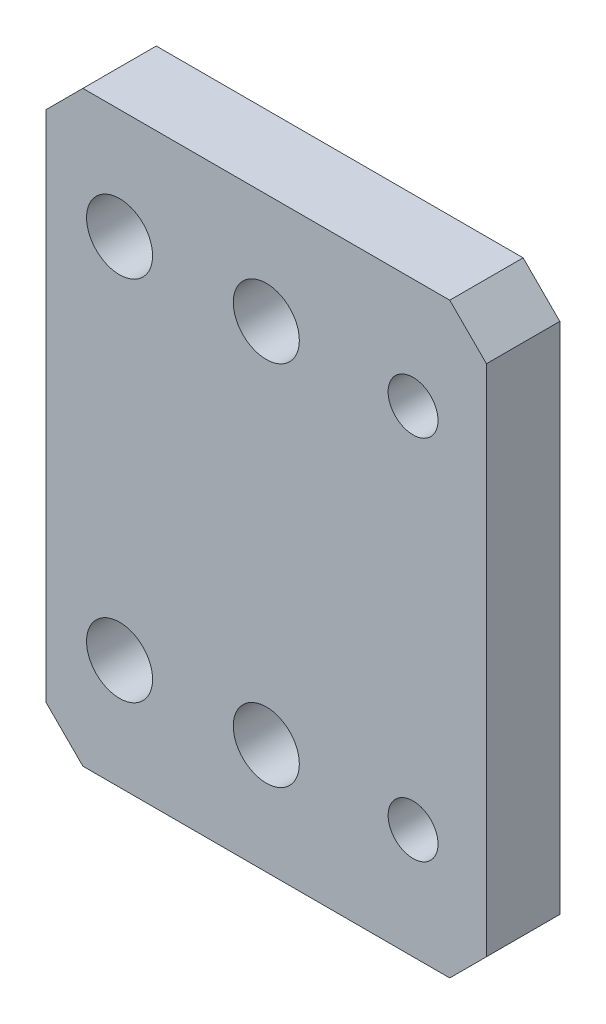
ISO-10303-21;
HEADER;
FILE_DESCRIPTION(('STEP AP214'),'2;1');
FILE_NAME('part.step','',(''),(''),'','','');
FILE_SCHEMA(('AUTOMOTIVE_DESIGN { 1 0 10303 214 1 1 1 1 }'));
ENDSEC;
DATA;
#1=APPLICATION_CONTEXT('core data for automotive mechanical design processes');
#2=APPLICATION_PROTOCOL_DEFINITION('international standard','automotive_design',2000,#1);
#3=PRODUCT_CONTEXT('',#1,'mechanical');
#4=PRODUCT('Part','Part','',(#3));
#5=PRODUCT_RELATED_PRODUCT_CATEGORY('part','',(#4));
#6=PRODUCT_DEFINITION_FORMATION('','',#4);
#7=PRODUCT_DEFINITION_CONTEXT('part definition',#1,'design');
#8=PRODUCT_DEFINITION('design','',#6,#7);
#9=PRODUCT_DEFINITION_SHAPE('','',#8);
#10=(LENGTH_UNIT() NAMED_UNIT(*) SI_UNIT(.MILLI.,.METRE.));
#11=(NAMED_UNIT(*) PLANE_ANGLE_UNIT() SI_UNIT($,.RADIAN.));
#12=(NAMED_UNIT(*) SI_UNIT($,.STERADIAN.) SOLID_ANGLE_UNIT());
#13=UNCERTAINTY_MEASURE_WITH_UNIT(LENGTH_MEASURE(1.E-05),#10,'distance_accuracy_value','');
#14=(GEOMETRIC_REPRESENTATION_CONTEXT(3) GLOBAL_UNCERTAINTY_ASSIGNED_CONTEXT((#13)) GLOBAL_UNIT_ASSIGNED_CONTEXT((#10,
#11,#12)) REPRESENTATION_CONTEXT('',''));
#15=CARTESIAN_POINT('',(0.,0.,0.));
#16=DIRECTION('',(0.,0.,1.));
#17=DIRECTION('',(1.,0.,0.));
#18=AXIS2_PLACEMENT_3D('',#15,#16,#17);
#19=CARTESIAN_POINT('',(20.,40.,10.));
#20=DIRECTION('',(-1.,0.,0.));
#21=DIRECTION('',(0.,-1.,0.));
#22=AXIS2_PLACEMENT_3D('',#19,#20,#21);
#23=PLANE('',#22);
#24=DIRECTION('',(0.,1.,0.));
#25=VECTOR('',#24,1.);
#26=CARTESIAN_POINT('',(20.,40.,0.));
#27=LINE('',#26,#25);
#28=CARTESIAN_POINT('',(20.,-35.,0.));
#29=VERTEX_POINT('',#28);
#30=CARTESIAN_POINT('',(20.,35.,0.));
#31=VERTEX_POINT('',#30);
#32=EDGE_CURVE('E130',#29,#31,#27,.T.);
#33=ORIENTED_EDGE('',*,*,#32,.T.);
#34=DIRECTION('',(0.,0.,1.));
#35=VECTOR('',#34,1.);
#36=CARTESIAN_POINT('',(20.,35.,10.));
#37=LINE('',#36,#35);
#38=CARTESIAN_POINT('',(20.,35.,10.));
#39=VERTEX_POINT('',#38);
#40=EDGE_CURVE('E108',#31,#39,#37,.T.);
#41=ORIENTED_EDGE('',*,*,#40,.T.);
#42=DIRECTION('',(0.,1.,0.));
#43=VECTOR('',#42,1.);
#44=CARTESIAN_POINT('',(20.,40.,10.));
#45=LINE('',#44,#43);
#46=CARTESIAN_POINT('',(20.,-35.,10.));
#47=VERTEX_POINT('',#46);
#48=EDGE_CURVE('E140',#47,#39,#45,.T.);
#49=ORIENTED_EDGE('',*,*,#48,.F.);
#50=DIRECTION('',(0.,0.,-1.));
#51=VECTOR('',#50,1.);
#52=CARTESIAN_POINT('',(20.,-35.,10.));
#53=LINE('',#52,#51);
#54=EDGE_CURVE('E113',#47,#29,#53,.T.);
#55=ORIENTED_EDGE('',*,*,#54,.T.);
#56=EDGE_LOOP('',(#33,#41,#49,#55));
#57=FACE_BOUND('',#56,.T.);
#58=ADVANCED_FACE('F36',(#57),#23,.F.);
#59=CARTESIAN_POINT('',(-40.,40.,10.));
#60=DIRECTION('',(0.,-1.,0.));
#61=DIRECTION('',(0.,0.,-1.));
#62=AXIS2_PLACEMENT_3D('',#59,#60,#61);
#63=PLANE('',#62);
#64=DIRECTION('',(-1.,0.,0.));
#65=VECTOR('',#64,1.);
#66=CARTESIAN_POINT('',(-40.,40.,10.));
#67=LINE('',#66,#65);
#68=CARTESIAN_POINT('',(15.,40.,10.));
#69=VERTEX_POINT('',#68);
#70=CARTESIAN_POINT('',(-35.,40.,10.));
#71=VERTEX_POINT('',#70);
#72=EDGE_CURVE('E123',#69,#71,#67,.T.);
#73=ORIENTED_EDGE('',*,*,#72,.F.);
#74=DIRECTION('',(0.,0.,-1.));
#75=VECTOR('',#74,1.);
#76=CARTESIAN_POINT('',(15.,40.,10.));
#77=LINE('',#76,#75);
#78=CARTESIAN_POINT('',(15.,40.,0.));
#79=VERTEX_POINT('',#78);
#80=EDGE_CURVE('E107',#69,#79,#77,.T.);
#81=ORIENTED_EDGE('',*,*,#80,.T.);
#82=DIRECTION('',(-1.,0.,0.));
#83=VECTOR('',#82,1.);
#84=CARTESIAN_POINT('',(-40.,40.,0.));
#85=LINE('',#84,#83);
#86=CARTESIAN_POINT('',(-35.,40.,0.));
#87=VERTEX_POINT('',#86);
#88=EDGE_CURVE('E120',#79,#87,#85,.T.);
#89=ORIENTED_EDGE('',*,*,#88,.T.);
#90=DIRECTION('',(0.,0.,1.));
#91=VECTOR('',#90,1.);
#92=CARTESIAN_POINT('',(-35.,40.,10.));
#93=LINE('',#92,#91);
#94=EDGE_CURVE('E125',#87,#71,#93,.T.);
#95=ORIENTED_EDGE('',*,*,#94,.T.);
#96=EDGE_LOOP('',(#73,#81,#89,#95));
#97=FACE_BOUND('',#96,.T.);
#98=ADVANCED_FACE('F119',(#97),#63,.F.);
#99=CARTESIAN_POINT('',(-40.,40.,10.));
#100=DIRECTION('',(1.,0.,0.));
#101=DIRECTION('',(0.,0.,-1.));
#102=AXIS2_PLACEMENT_3D('',#99,#100,#101);
#103=PLANE('',#102);
#104=DIRECTION('',(0.,-1.,0.));
#105=VECTOR('',#104,1.);
#106=CARTESIAN_POINT('',(-40.,40.,10.));
#107=LINE('',#106,#105);
#108=CARTESIAN_POINT('',(-40.,35.,10.));
#109=VERTEX_POINT('',#108);
#110=CARTESIAN_POINT('',(-40.,-35.,10.));
#111=VERTEX_POINT('',#110);
#112=EDGE_CURVE('E197',#109,#111,#107,.T.);
#113=ORIENTED_EDGE('',*,*,#112,.F.);
#114=DIRECTION('',(0.,0.,-1.));
#115=VECTOR('',#114,1.);
#116=CARTESIAN_POINT('',(-40.,35.,10.));
#117=LINE('',#116,#115);
#118=CARTESIAN_POINT('',(-40.,35.,0.));
#119=VERTEX_POINT('',#118);
#120=EDGE_CURVE('E159',#109,#119,#117,.T.);
#121=ORIENTED_EDGE('',*,*,#120,.T.);
#122=DIRECTION('',(0.,-1.,0.));
#123=VECTOR('',#122,1.);
#124=CARTESIAN_POINT('',(-40.,40.,0.));
#125=LINE('',#124,#123);
#126=CARTESIAN_POINT('',(-40.,-35.,0.));
#127=VERTEX_POINT('',#126);
#128=EDGE_CURVE('E129',#119,#127,#125,.T.);
#129=ORIENTED_EDGE('',*,*,#128,.T.);
#130=DIRECTION('',(0.,0.,1.));
#131=VECTOR('',#130,1.);
#132=CARTESIAN_POINT('',(-40.,-35.,10.));
#133=LINE('',#132,#131);
#134=EDGE_CURVE('E157',#127,#111,#133,.T.);
#135=ORIENTED_EDGE('',*,*,#134,.T.);
#136=EDGE_LOOP('',(#113,#121,#129,#135));
#137=FACE_BOUND('',#136,.T.);
#138=ADVANCED_FACE('F212',(#137),#103,.F.);
#139=CARTESIAN_POINT('',(-40.,-40.,10.));
#140=DIRECTION('',(0.,1.,0.));
#141=DIRECTION('',(0.,0.,1.));
#142=AXIS2_PLACEMENT_3D('',#139,#140,#141);
#143=PLANE('',#142);
#144=DIRECTION('',(1.,0.,0.));
#145=VECTOR('',#144,1.);
#146=CARTESIAN_POINT('',(-40.,-40.,0.));
#147=LINE('',#146,#145);
#148=CARTESIAN_POINT('',(-35.,-40.,0.));
#149=VERTEX_POINT('',#148);
#150=CARTESIAN_POINT('',(15.,-40.,0.));
#151=VERTEX_POINT('',#150);
#152=EDGE_CURVE('E133',#149,#151,#147,.T.);
#153=ORIENTED_EDGE('',*,*,#152,.T.);
#154=DIRECTION('',(0.,0.,1.));
#155=VECTOR('',#154,1.);
#156=CARTESIAN_POINT('',(15.,-40.,10.));
#157=LINE('',#156,#155);
#158=CARTESIAN_POINT('',(15.,-40.,10.));
#159=VERTEX_POINT('',#158);
#160=EDGE_CURVE('E11',#151,#159,#157,.T.);
#161=ORIENTED_EDGE('',*,*,#160,.T.);
#162=DIRECTION('',(1.,0.,0.));
#163=VECTOR('',#162,1.);
#164=CARTESIAN_POINT('',(-40.,-40.,10.));
#165=LINE('',#164,#163);
#166=CARTESIAN_POINT('',(-35.,-40.,10.));
#167=VERTEX_POINT('',#166);
#168=EDGE_CURVE('E141',#167,#159,#165,.T.);
#169=ORIENTED_EDGE('',*,*,#168,.F.);
#170=DIRECTION('',(0.,0.,-1.));
#171=VECTOR('',#170,1.);
#172=CARTESIAN_POINT('',(-35.,-40.,10.));
#173=LINE('',#172,#171);
#174=EDGE_CURVE('E45',#167,#149,#173,.T.);
#175=ORIENTED_EDGE('',*,*,#174,.T.);
#176=EDGE_LOOP('',(#153,#161,#169,#175));
#177=FACE_BOUND('',#176,.T.);
#178=ADVANCED_FACE('F207',(#177),#143,.F.);
#179=CARTESIAN_POINT('',(20.,-40.,10.));
#180=DIRECTION('',(0.,0.,1.));
#181=DIRECTION('',(1.,0.,0.));
#182=AXIS2_PLACEMENT_3D('',#179,#180,#181);
#183=PLANE('',#182);
#184=CARTESIAN_POINT('',(10.,-25.,10.));
#185=DIRECTION('',(0.,0.,1.));
#186=DIRECTION('',(1.,0.,0.));
#187=AXIS2_PLACEMENT_3D('',#184,#185,#186);
#188=CIRCLE('',#187,3.39999999999999);
#189=CARTESIAN_POINT('',(13.4,-25.,10.));
#190=VERTEX_POINT('',#189);
#191=EDGE_CURVE('E268',#190,#190,#188,.T.);
#192=ORIENTED_EDGE('',*,*,#191,.F.);
#193=EDGE_LOOP('',(#192));
#194=FACE_BOUND('',#193,.T.);
#195=CARTESIAN_POINT('',(10.,25.,10.));
#196=DIRECTION('',(0.,0.,1.));
#197=DIRECTION('',(1.,0.,0.));
#198=AXIS2_PLACEMENT_3D('',#195,#196,#197);
#199=CIRCLE('',#198,3.39999999999999);
#200=CARTESIAN_POINT('',(13.4,25.,10.));
#201=VERTEX_POINT('',#200);
#202=EDGE_CURVE('E184',#201,#201,#199,.T.);
#203=ORIENTED_EDGE('',*,*,#202,.F.);
#204=EDGE_LOOP('',(#203));
#205=FACE_BOUND('',#204,.T.);
#206=CARTESIAN_POINT('',(-30.,25.,10.));
#207=DIRECTION('',(0.,0.,1.));
#208=DIRECTION('',(1.,0.,0.));
#209=AXIS2_PLACEMENT_3D('',#206,#207,#208);
#210=CIRCLE('',#209,4.5);
#211=CARTESIAN_POINT('',(-25.5,25.,10.));
#212=VERTEX_POINT('',#211);
#213=EDGE_CURVE('E174',#212,#212,#210,.T.);
#214=ORIENTED_EDGE('',*,*,#213,.F.);
#215=EDGE_LOOP('',(#214));
#216=FACE_BOUND('',#215,.T.);
#217=CARTESIAN_POINT('',(-30.,-25.,10.));
#218=DIRECTION('',(0.,0.,1.));
#219=DIRECTION('',(1.,0.,0.));
#220=AXIS2_PLACEMENT_3D('',#217,#218,#219);
#221=CIRCLE('',#220,4.5);
#222=CARTESIAN_POINT('',(-25.5,-25.,10.));
#223=VERTEX_POINT('',#222);
#224=EDGE_CURVE('E171',#223,#223,#221,.T.);
#225=ORIENTED_EDGE('',*,*,#224,.F.);
#226=EDGE_LOOP('',(#225));
#227=FACE_BOUND('',#226,.T.);
#228=CARTESIAN_POINT('',(-9.99999999999998,-25.,10.));
#229=DIRECTION('',(0.,0.,1.));
#230=DIRECTION('',(1.,0.,0.));
#231=AXIS2_PLACEMENT_3D('',#228,#229,#230);
#232=CIRCLE('',#231,4.5);
#233=CARTESIAN_POINT('',(-5.49999999999999,-25.,10.));
#234=VERTEX_POINT('',#233);
#235=EDGE_CURVE('E168',#234,#234,#232,.T.);
#236=ORIENTED_EDGE('',*,*,#235,.F.);
#237=EDGE_LOOP('',(#236));
#238=FACE_BOUND('',#237,.T.);
#239=CARTESIAN_POINT('',(-9.99999999999998,25.,10.));
#240=DIRECTION('',(0.,0.,1.));
#241=DIRECTION('',(1.,0.,0.));
#242=AXIS2_PLACEMENT_3D('',#239,#240,#241);
#243=CIRCLE('',#242,4.5);
#244=CARTESIAN_POINT('',(-5.49999999999999,25.,10.));
#245=VERTEX_POINT('',#244);
#246=EDGE_CURVE('E167',#245,#245,#243,.T.);
#247=ORIENTED_EDGE('',*,*,#246,.F.);
#248=EDGE_LOOP('',(#247));
#249=FACE_BOUND('',#248,.T.);
#250=ORIENTED_EDGE('',*,*,#48,.T.);
#251=DIRECTION('',(0.707106781186547,-0.707106781186549,0.));
#252=VECTOR('',#251,1.);
#253=CARTESIAN_POINT('',(57.5,-2.50000000000011,10.));
#254=LINE('',#253,#252);
#255=EDGE_CURVE('E155',#39,#69,#254,.F.);
#256=ORIENTED_EDGE('',*,*,#255,.T.);
#257=ORIENTED_EDGE('',*,*,#72,.T.);
#258=DIRECTION('',(0.70710678118655,0.707106781186546,0.));
#259=VECTOR('',#258,1.);
#260=CARTESIAN_POINT('',(-47.4999999999998,27.5000000000002,10.));
#261=LINE('',#260,#259);
#262=EDGE_CURVE('E153',#71,#109,#261,.F.);
#263=ORIENTED_EDGE('',*,*,#262,.T.);
#264=ORIENTED_EDGE('',*,*,#112,.T.);
#265=DIRECTION('',(-0.707106781186546,0.70710678118655,0.));
#266=VECTOR('',#265,1.);
#267=CARTESIAN_POINT('',(-7.50000000000017,-67.5,10.));
#268=LINE('',#267,#266);
#269=EDGE_CURVE('E58',#111,#167,#268,.F.);
#270=ORIENTED_EDGE('',*,*,#269,.T.);
#271=ORIENTED_EDGE('',*,*,#168,.T.);
#272=DIRECTION('',(-0.707106781186549,-0.707106781186547,0.));
#273=VECTOR('',#272,1.);
#274=CARTESIAN_POINT('',(17.5,-37.5,10.));
#275=LINE('',#274,#273);
#276=EDGE_CURVE('E151',#159,#47,#275,.F.);
#277=ORIENTED_EDGE('',*,*,#276,.T.);
#278=EDGE_LOOP('',(#250,#256,#257,#263,#264,#270,#271,#277));
#279=FACE_BOUND('',#278,.T.);
#280=ADVANCED_FACE('F199',(#194,#205,#216,#227,#238,#249,#279),#183,.T.);
#281=CARTESIAN_POINT('',(20.,-40.,0.));
#282=DIRECTION('',(0.,0.,1.));
#283=DIRECTION('',(1.,0.,0.));
#284=AXIS2_PLACEMENT_3D('',#281,#282,#283);
#285=PLANE('',#284);
#286=CARTESIAN_POINT('',(10.,-25.,0.));
#287=DIRECTION('',(0.,0.,1.));
#288=DIRECTION('',(1.,0.,0.));
#289=AXIS2_PLACEMENT_3D('',#286,#287,#288);
#290=CIRCLE('',#289,3.39999999999999);
#291=CARTESIAN_POINT('',(13.4,-25.,0.));
#292=VERTEX_POINT('',#291);
#293=EDGE_CURVE('E271',#292,#292,#290,.T.);
#294=ORIENTED_EDGE('',*,*,#293,.T.);
#295=EDGE_LOOP('',(#294));
#296=FACE_BOUND('',#295,.T.);
#297=CARTESIAN_POINT('',(10.,25.,0.));
#298=DIRECTION('',(0.,0.,1.));
#299=DIRECTION('',(1.,0.,0.));
#300=AXIS2_PLACEMENT_3D('',#297,#298,#299);
#301=CIRCLE('',#300,3.39999999999999);
#302=CARTESIAN_POINT('',(13.4,25.,0.));
#303=VERTEX_POINT('',#302);
#304=EDGE_CURVE('E40',#303,#303,#301,.T.);
#305=ORIENTED_EDGE('',*,*,#304,.T.);
#306=EDGE_LOOP('',(#305));
#307=FACE_BOUND('',#306,.T.);
#308=CARTESIAN_POINT('',(-30.,25.,0.));
#309=DIRECTION('',(0.,0.,1.));
#310=DIRECTION('',(1.,0.,0.));
#311=AXIS2_PLACEMENT_3D('',#308,#309,#310);
#312=CIRCLE('',#311,4.49999999999999);
#313=CARTESIAN_POINT('',(-25.5,25.,0.));
#314=VERTEX_POINT('',#313);
#315=EDGE_CURVE('E172',#314,#314,#312,.T.);
#316=ORIENTED_EDGE('',*,*,#315,.T.);
#317=EDGE_LOOP('',(#316));
#318=FACE_BOUND('',#317,.T.);
#319=CARTESIAN_POINT('',(-30.,-25.,0.));
#320=DIRECTION('',(0.,0.,1.));
#321=DIRECTION('',(1.,0.,0.));
#322=AXIS2_PLACEMENT_3D('',#319,#320,#321);
#323=CIRCLE('',#322,4.49999999999999);
#324=CARTESIAN_POINT('',(-25.5,-25.,0.));
#325=VERTEX_POINT('',#324);
#326=EDGE_CURVE('E169',#325,#325,#323,.T.);
#327=ORIENTED_EDGE('',*,*,#326,.T.);
#328=EDGE_LOOP('',(#327));
#329=FACE_BOUND('',#328,.T.);
#330=CARTESIAN_POINT('',(-9.99999999999998,-25.,0.));
#331=DIRECTION('',(0.,0.,1.));
#332=DIRECTION('',(1.,0.,0.));
#333=AXIS2_PLACEMENT_3D('',#330,#331,#332);
#334=CIRCLE('',#333,4.49999999999999);
#335=CARTESIAN_POINT('',(-5.49999999999999,-25.,0.));
#336=VERTEX_POINT('',#335);
#337=EDGE_CURVE('E164',#336,#336,#334,.T.);
#338=ORIENTED_EDGE('',*,*,#337,.T.);
#339=EDGE_LOOP('',(#338));
#340=FACE_BOUND('',#339,.T.);
#341=CARTESIAN_POINT('',(-9.99999999999998,25.,0.));
#342=DIRECTION('',(0.,0.,1.));
#343=DIRECTION('',(1.,0.,0.));
#344=AXIS2_PLACEMENT_3D('',#341,#342,#343);
#345=CIRCLE('',#344,4.49999999999999);
#346=CARTESIAN_POINT('',(-5.49999999999999,25.,0.));
#347=VERTEX_POINT('',#346);
#348=EDGE_CURVE('E135',#347,#347,#345,.T.);
#349=ORIENTED_EDGE('',*,*,#348,.T.);
#350=EDGE_LOOP('',(#349));
#351=FACE_BOUND('',#350,.T.);
#352=ORIENTED_EDGE('',*,*,#88,.F.);
#353=DIRECTION('',(-0.707106781186547,0.707106781186549,0.));
#354=VECTOR('',#353,1.);
#355=CARTESIAN_POINT('',(15.,40.,0.));
#356=LINE('',#355,#354);
#357=EDGE_CURVE('E103',#79,#31,#356,.F.);
#358=ORIENTED_EDGE('',*,*,#357,.T.);
#359=ORIENTED_EDGE('',*,*,#32,.F.);
#360=DIRECTION('',(0.707106781186549,0.707106781186547,0.));
#361=VECTOR('',#360,1.);
#362=CARTESIAN_POINT('',(20.,-35.,0.));
#363=LINE('',#362,#361);
#364=EDGE_CURVE('E144',#29,#151,#363,.F.);
#365=ORIENTED_EDGE('',*,*,#364,.T.);
#366=ORIENTED_EDGE('',*,*,#152,.F.);
#367=DIRECTION('',(0.707106781186546,-0.70710678118655,0.));
#368=VECTOR('',#367,1.);
#369=CARTESIAN_POINT('',(-35.,-40.,0.));
#370=LINE('',#369,#368);
#371=EDGE_CURVE('E124',#149,#127,#370,.F.);
#372=ORIENTED_EDGE('',*,*,#371,.T.);
#373=ORIENTED_EDGE('',*,*,#128,.F.);
#374=DIRECTION('',(-0.70710678118655,-0.707106781186546,0.));
#375=VECTOR('',#374,1.);
#376=CARTESIAN_POINT('',(-40.,35.,0.));
#377=LINE('',#376,#375);
#378=EDGE_CURVE('E114',#119,#87,#377,.F.);
#379=ORIENTED_EDGE('',*,*,#378,.T.);
#380=EDGE_LOOP('',(#352,#358,#359,#365,#366,#372,#373,#379));
#381=FACE_BOUND('',#380,.T.);
#382=ADVANCED_FACE('F127',(#296,#307,#318,#329,#340,#351,#381),#285,.F.);
#383=CARTESIAN_POINT('',(15.,40.,10.));
#384=DIRECTION('',(-0.707106781186549,-0.707106781186547,0.));
#385=DIRECTION('',(0.707106781186547,-0.707106781186549,0.));
#386=AXIS2_PLACEMENT_3D('',#383,#384,#385);
#387=PLANE('',#386);
#388=ORIENTED_EDGE('',*,*,#255,.F.);
#389=ORIENTED_EDGE('',*,*,#40,.F.);
#390=ORIENTED_EDGE('',*,*,#357,.F.);
#391=ORIENTED_EDGE('',*,*,#80,.F.);
#392=EDGE_LOOP('',(#388,#389,#390,#391));
#393=FACE_BOUND('',#392,.T.);
#394=ADVANCED_FACE('F106',(#393),#387,.F.);
#395=CARTESIAN_POINT('',(-40.,35.,10.));
#396=DIRECTION('',(0.707106781186545,-0.707106781186549,0.));
#397=DIRECTION('',(0.70710678118655,0.707106781186546,0.));
#398=AXIS2_PLACEMENT_3D('',#395,#396,#397);
#399=PLANE('',#398);
#400=ORIENTED_EDGE('',*,*,#262,.F.);
#401=ORIENTED_EDGE('',*,*,#94,.F.);
#402=ORIENTED_EDGE('',*,*,#378,.F.);
#403=ORIENTED_EDGE('',*,*,#120,.F.);
#404=EDGE_LOOP('',(#400,#401,#402,#403));
#405=FACE_BOUND('',#404,.T.);
#406=ADVANCED_FACE('F216',(#405),#399,.F.);
#407=CARTESIAN_POINT('',(20.,-35.,10.));
#408=DIRECTION('',(-0.707106781186546,0.707106781186548,0.));
#409=DIRECTION('',(-0.707106781186549,-0.707106781186547,0.));
#410=AXIS2_PLACEMENT_3D('',#407,#408,#409);
#411=PLANE('',#410);
#412=ORIENTED_EDGE('',*,*,#276,.F.);
#413=ORIENTED_EDGE('',*,*,#160,.F.);
#414=ORIENTED_EDGE('',*,*,#364,.F.);
#415=ORIENTED_EDGE('',*,*,#54,.F.);
#416=EDGE_LOOP('',(#412,#413,#414,#415));
#417=FACE_BOUND('',#416,.T.);
#418=ADVANCED_FACE('F204',(#417),#411,.F.);
#419=CARTESIAN_POINT('',(-35.,-40.,10.));
#420=DIRECTION('',(0.707106781186549,0.707106781186545,0.));
#421=DIRECTION('',(-0.707106781186546,0.70710678118655,0.));
#422=AXIS2_PLACEMENT_3D('',#419,#420,#421);
#423=PLANE('',#422);
#424=ORIENTED_EDGE('',*,*,#269,.F.);
#425=ORIENTED_EDGE('',*,*,#134,.F.);
#426=ORIENTED_EDGE('',*,*,#371,.F.);
#427=ORIENTED_EDGE('',*,*,#174,.F.);
#428=EDGE_LOOP('',(#424,#425,#426,#427));
#429=FACE_BOUND('',#428,.T.);
#430=ADVANCED_FACE('F38',(#429),#423,.F.);
#431=CARTESIAN_POINT('',(-9.99999999999998,25.,10.));
#432=DIRECTION('',(0.,0.,1.));
#433=DIRECTION('',(1.,0.,0.));
#434=AXIS2_PLACEMENT_3D('',#431,#432,#433);
#435=CYLINDRICAL_SURFACE('',#434,4.49999999999999);
#436=ORIENTED_EDGE('',*,*,#246,.T.);
#437=EDGE_LOOP('',(#436));
#438=FACE_BOUND('',#437,.T.);
#439=ORIENTED_EDGE('',*,*,#348,.F.);
#440=EDGE_LOOP('',(#439));
#441=FACE_BOUND('',#440,.T.);
#442=ADVANCED_FACE('F241',(#438,#441),#435,.F.);
#443=CARTESIAN_POINT('',(-9.99999999999998,-25.,10.));
#444=DIRECTION('',(0.,0.,1.));
#445=DIRECTION('',(1.,0.,0.));
#446=AXIS2_PLACEMENT_3D('',#443,#444,#445);
#447=CYLINDRICAL_SURFACE('',#446,4.49999999999999);
#448=ORIENTED_EDGE('',*,*,#235,.T.);
#449=EDGE_LOOP('',(#448));
#450=FACE_BOUND('',#449,.T.);
#451=ORIENTED_EDGE('',*,*,#337,.F.);
#452=EDGE_LOOP('',(#451));
#453=FACE_BOUND('',#452,.T.);
#454=ADVANCED_FACE('F244',(#450,#453),#447,.F.);
#455=CARTESIAN_POINT('',(-30.,-25.,10.));
#456=DIRECTION('',(0.,0.,1.));
#457=DIRECTION('',(1.,0.,0.));
#458=AXIS2_PLACEMENT_3D('',#455,#456,#457);
#459=CYLINDRICAL_SURFACE('',#458,4.49999999999999);
#460=ORIENTED_EDGE('',*,*,#224,.T.);
#461=EDGE_LOOP('',(#460));
#462=FACE_BOUND('',#461,.T.);
#463=ORIENTED_EDGE('',*,*,#326,.F.);
#464=EDGE_LOOP('',(#463));
#465=FACE_BOUND('',#464,.T.);
#466=ADVANCED_FACE('F248',(#462,#465),#459,.F.);
#467=CARTESIAN_POINT('',(-30.,25.,10.));
#468=DIRECTION('',(0.,0.,1.));
#469=DIRECTION('',(1.,0.,0.));
#470=AXIS2_PLACEMENT_3D('',#467,#468,#469);
#471=CYLINDRICAL_SURFACE('',#470,4.49999999999999);
#472=ORIENTED_EDGE('',*,*,#213,.T.);
#473=EDGE_LOOP('',(#472));
#474=FACE_BOUND('',#473,.T.);
#475=ORIENTED_EDGE('',*,*,#315,.F.);
#476=EDGE_LOOP('',(#475));
#477=FACE_BOUND('',#476,.T.);
#478=ADVANCED_FACE('F252',(#474,#477),#471,.F.);
#479=CARTESIAN_POINT('',(10.,25.,10.));
#480=DIRECTION('',(0.,0.,1.));
#481=DIRECTION('',(1.,0.,0.));
#482=AXIS2_PLACEMENT_3D('',#479,#480,#481);
#483=CYLINDRICAL_SURFACE('',#482,3.39999999999999);
#484=ORIENTED_EDGE('',*,*,#202,.T.);
#485=EDGE_LOOP('',(#484));
#486=FACE_BOUND('',#485,.T.);
#487=ORIENTED_EDGE('',*,*,#304,.F.);
#488=EDGE_LOOP('',(#487));
#489=FACE_BOUND('',#488,.T.);
#490=ADVANCED_FACE('F256',(#486,#489),#483,.F.);
#491=CARTESIAN_POINT('',(10.,-25.,10.));
#492=DIRECTION('',(0.,0.,1.));
#493=DIRECTION('',(1.,0.,0.));
#494=AXIS2_PLACEMENT_3D('',#491,#492,#493);
#495=CYLINDRICAL_SURFACE('',#494,3.39999999999999);
#496=ORIENTED_EDGE('',*,*,#191,.T.);
#497=EDGE_LOOP('',(#496));
#498=FACE_BOUND('',#497,.T.);
#499=ORIENTED_EDGE('',*,*,#293,.F.);
#500=EDGE_LOOP('',(#499));
#501=FACE_BOUND('',#500,.T.);
#502=ADVANCED_FACE('F259',(#498,#501),#495,.F.);
#503=CLOSED_SHELL('',(#58,#98,#138,#178,#280,#382,#394,#406,#418,#430,#442,#454,#466,#478,#490,#502));
#504=MANIFOLD_SOLID_BREP('B2',#503);
#505=ADVANCED_BREP_SHAPE_REPRESENTATION('',(#18,#504),#14);
#506=SHAPE_DEFINITION_REPRESENTATION(#9,#505);
ENDSEC;
END-ISO-10303-21;
